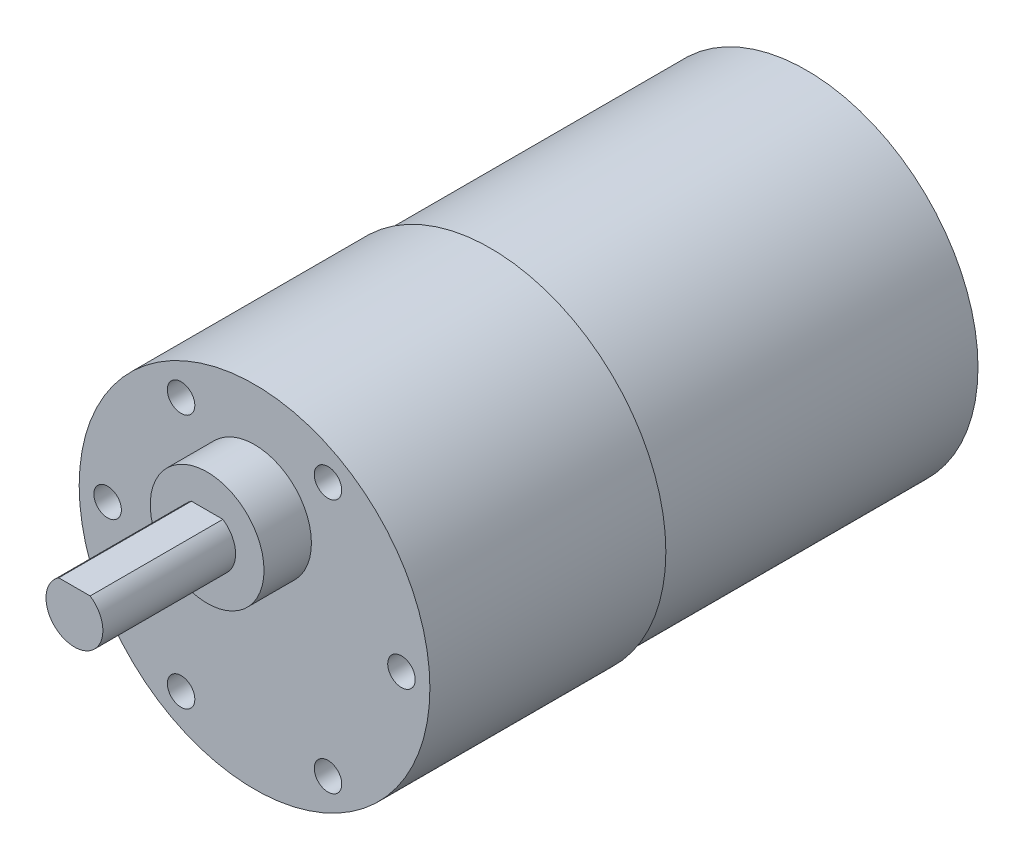
ISO-10303-21;
HEADER;
FILE_DESCRIPTION(('STEP AP214'),'2;1');
FILE_NAME('part.step','',(''),(''),'','','');
FILE_SCHEMA(('AUTOMOTIVE_DESIGN { 1 0 10303 214 1 1 1 1 }'));
ENDSEC;
DATA;
#1=APPLICATION_CONTEXT('core data for automotive mechanical design processes');
#2=APPLICATION_PROTOCOL_DEFINITION('international standard','automotive_design',2000,#1);
#3=PRODUCT_CONTEXT('',#1,'mechanical');
#4=PRODUCT('Part','Part','',(#3));
#5=PRODUCT_RELATED_PRODUCT_CATEGORY('part','',(#4));
#6=PRODUCT_DEFINITION_FORMATION('','',#4);
#7=PRODUCT_DEFINITION_CONTEXT('part definition',#1,'design');
#8=PRODUCT_DEFINITION('design','',#6,#7);
#9=PRODUCT_DEFINITION_SHAPE('','',#8);
#10=(LENGTH_UNIT() NAMED_UNIT(*) SI_UNIT(.MILLI.,.METRE.));
#11=(NAMED_UNIT(*) PLANE_ANGLE_UNIT() SI_UNIT($,.RADIAN.));
#12=(NAMED_UNIT(*) SI_UNIT($,.STERADIAN.) SOLID_ANGLE_UNIT());
#13=UNCERTAINTY_MEASURE_WITH_UNIT(LENGTH_MEASURE(1.E-05),#10,'distance_accuracy_value','');
#14=(GEOMETRIC_REPRESENTATION_CONTEXT(3) GLOBAL_UNCERTAINTY_ASSIGNED_CONTEXT((#13)) GLOBAL_UNIT_ASSIGNED_CONTEXT((#10,
#11,#12)) REPRESENTATION_CONTEXT('',''));
#15=CARTESIAN_POINT('',(0.,0.,0.));
#16=DIRECTION('',(0.,0.,1.));
#17=DIRECTION('',(1.,0.,0.));
#18=AXIS2_PLACEMENT_3D('',#15,#16,#17);
#19=CARTESIAN_POINT('',(0.,0.,24.892));
#20=DIRECTION('',(0.,0.,-1.));
#21=DIRECTION('',(-1.,0.,0.));
#22=AXIS2_PLACEMENT_3D('',#19,#20,#21);
#23=CYLINDRICAL_SURFACE('',#22,18.5);
#24=CARTESIAN_POINT('',(0.,0.,24.892));
#25=DIRECTION('',(0.,0.,1.));
#26=DIRECTION('',(1.,0.,0.));
#27=AXIS2_PLACEMENT_3D('',#24,#25,#26);
#28=CIRCLE('',#27,18.5);
#29=CARTESIAN_POINT('',(18.5,0.,24.892));
#30=VERTEX_POINT('',#29);
#31=EDGE_CURVE('E52',#30,#30,#28,.T.);
#32=ORIENTED_EDGE('',*,*,#31,.F.);
#33=EDGE_LOOP('',(#32));
#34=FACE_BOUND('',#33,.T.);
#35=CARTESIAN_POINT('',(0.,0.,0.));
#36=DIRECTION('',(0.,0.,1.));
#37=DIRECTION('',(1.,0.,0.));
#38=AXIS2_PLACEMENT_3D('',#35,#36,#37);
#39=CIRCLE('',#38,18.5);
#40=CARTESIAN_POINT('',(18.5,0.,0.));
#41=VERTEX_POINT('',#40);
#42=EDGE_CURVE('E47',#41,#41,#39,.T.);
#43=ORIENTED_EDGE('',*,*,#42,.T.);
#44=EDGE_LOOP('',(#43));
#45=FACE_BOUND('',#44,.T.);
#46=ADVANCED_FACE('F44',(#34,#45),#23,.T.);
#47=CARTESIAN_POINT('',(0.,0.,24.892));
#48=DIRECTION('',(0.,0.,1.));
#49=DIRECTION('',(1.,0.,0.));
#50=AXIS2_PLACEMENT_3D('',#47,#48,#49);
#51=PLANE('',#50);
#52=CARTESIAN_POINT('',(15.5,0.,24.892));
#53=DIRECTION('',(0.,0.,1.));
#54=DIRECTION('',(1.,0.,0.));
#55=AXIS2_PLACEMENT_3D('',#52,#53,#54);
#56=CIRCLE('',#55,1.45);
#57=CARTESIAN_POINT('',(16.95,0.,24.892));
#58=VERTEX_POINT('',#57);
#59=EDGE_CURVE('E350',#58,#58,#56,.T.);
#60=ORIENTED_EDGE('',*,*,#59,.F.);
#61=EDGE_LOOP('',(#60));
#62=FACE_BOUND('',#61,.T.);
#63=CARTESIAN_POINT('',(7.75000000000016,13.4233937586587,24.892));
#64=DIRECTION('',(0.,0.,1.));
#65=DIRECTION('',(1.,0.,0.));
#66=AXIS2_PLACEMENT_3D('',#63,#64,#65);
#67=CIRCLE('',#66,1.45);
#68=CARTESIAN_POINT('',(9.20000000000016,13.4233937586587,24.892));
#69=VERTEX_POINT('',#68);
#70=EDGE_CURVE('E351',#69,#69,#67,.T.);
#71=ORIENTED_EDGE('',*,*,#70,.F.);
#72=EDGE_LOOP('',(#71));
#73=FACE_BOUND('',#72,.T.);
#74=CARTESIAN_POINT('',(-7.74999999999987,13.4233937586589,24.892));
#75=DIRECTION('',(0.,0.,1.));
#76=DIRECTION('',(1.,0.,0.));
#77=AXIS2_PLACEMENT_3D('',#74,#75,#76);
#78=CIRCLE('',#77,1.45);
#79=CARTESIAN_POINT('',(-6.29999999999988,13.4233937586589,24.892));
#80=VERTEX_POINT('',#79);
#81=EDGE_CURVE('E325',#80,#80,#78,.T.);
#82=ORIENTED_EDGE('',*,*,#81,.F.);
#83=EDGE_LOOP('',(#82));
#84=FACE_BOUND('',#83,.T.);
#85=CARTESIAN_POINT('',(-15.5,1.08235921504137E-13,24.892));
#86=DIRECTION('',(0.,0.,1.));
#87=DIRECTION('',(1.,0.,0.));
#88=AXIS2_PLACEMENT_3D('',#85,#86,#87);
#89=CIRCLE('',#88,1.45);
#90=CARTESIAN_POINT('',(-14.05,1.08235921504137E-13,24.892));
#91=VERTEX_POINT('',#90);
#92=EDGE_CURVE('E332',#91,#91,#89,.T.);
#93=ORIENTED_EDGE('',*,*,#92,.F.);
#94=EDGE_LOOP('',(#93));
#95=FACE_BOUND('',#94,.T.);
#96=CARTESIAN_POINT('',(-7.75000000000006,-13.4233937586588,24.892));
#97=DIRECTION('',(0.,0.,1.));
#98=DIRECTION('',(1.,0.,0.));
#99=AXIS2_PLACEMENT_3D('',#96,#97,#98);
#100=CIRCLE('',#99,1.45);
#101=CARTESIAN_POINT('',(-6.30000000000006,-13.4233937586588,24.892));
#102=VERTEX_POINT('',#101);
#103=EDGE_CURVE('E338',#102,#102,#100,.T.);
#104=ORIENTED_EDGE('',*,*,#103,.F.);
#105=EDGE_LOOP('',(#104));
#106=FACE_BOUND('',#105,.T.);
#107=CARTESIAN_POINT('',(7.74999999999997,-13.4233937586588,24.892));
#108=DIRECTION('',(0.,0.,1.));
#109=DIRECTION('',(1.,0.,0.));
#110=AXIS2_PLACEMENT_3D('',#107,#108,#109);
#111=CIRCLE('',#110,1.45);
#112=CARTESIAN_POINT('',(9.19999999999997,-13.4233937586588,24.892));
#113=VERTEX_POINT('',#112);
#114=EDGE_CURVE('E344',#113,#113,#111,.T.);
#115=ORIENTED_EDGE('',*,*,#114,.F.);
#116=EDGE_LOOP('',(#115));
#117=FACE_BOUND('',#116,.T.);
#118=CARTESIAN_POINT('',(0.,7.,24.892));
#119=DIRECTION('',(0.,0.,1.));
#120=DIRECTION('',(1.,0.,0.));
#121=AXIS2_PLACEMENT_3D('',#118,#119,#120);
#122=CIRCLE('',#121,6.);
#123=CARTESIAN_POINT('',(6.,7.,24.892));
#124=VERTEX_POINT('',#123);
#125=EDGE_CURVE('E89',#124,#124,#122,.T.);
#126=ORIENTED_EDGE('',*,*,#125,.F.);
#127=EDGE_LOOP('',(#126));
#128=FACE_BOUND('',#127,.T.);
#129=ORIENTED_EDGE('',*,*,#31,.T.);
#130=EDGE_LOOP('',(#129));
#131=FACE_BOUND('',#130,.T.);
#132=ADVANCED_FACE('F110',(#62,#73,#84,#95,#106,#117,#128,#131),#51,.T.);
#133=CARTESIAN_POINT('',(0.,0.,0.));
#134=DIRECTION('',(0.,0.,1.));
#135=DIRECTION('',(1.,0.,0.));
#136=AXIS2_PLACEMENT_3D('',#133,#134,#135);
#137=PLANE('',#136);
#138=CARTESIAN_POINT('',(0.,0.,0.));
#139=DIRECTION('',(0.,0.,-1.));
#140=DIRECTION('',(-1.,0.,0.));
#141=AXIS2_PLACEMENT_3D('',#138,#139,#140);
#142=CIRCLE('',#141,18.1);
#143=CARTESIAN_POINT('',(-18.1,0.,0.));
#144=VERTEX_POINT('',#143);
#145=EDGE_CURVE('E13',#144,#144,#142,.T.);
#146=ORIENTED_EDGE('',*,*,#145,.F.);
#147=EDGE_LOOP('',(#146));
#148=FACE_BOUND('',#147,.T.);
#149=ORIENTED_EDGE('',*,*,#42,.F.);
#150=EDGE_LOOP('',(#149));
#151=FACE_BOUND('',#150,.T.);
#152=ADVANCED_FACE('F107',(#148,#151),#137,.F.);
#153=CARTESIAN_POINT('',(0.,0.,-33.33));
#154=DIRECTION('',(0.,0.,1.));
#155=DIRECTION('',(1.,0.,0.));
#156=AXIS2_PLACEMENT_3D('',#153,#154,#155);
#157=CYLINDRICAL_SURFACE('',#156,18.1);
#158=CARTESIAN_POINT('',(0.,0.,-33.33));
#159=DIRECTION('',(0.,0.,-1.));
#160=DIRECTION('',(-1.,0.,0.));
#161=AXIS2_PLACEMENT_3D('',#158,#159,#160);
#162=CIRCLE('',#161,18.1);
#163=CARTESIAN_POINT('',(-18.1,0.,-33.33));
#164=VERTEX_POINT('',#163);
#165=EDGE_CURVE('E96',#164,#164,#162,.T.);
#166=ORIENTED_EDGE('',*,*,#165,.F.);
#167=EDGE_LOOP('',(#166));
#168=FACE_BOUND('',#167,.T.);
#169=ORIENTED_EDGE('',*,*,#145,.T.);
#170=EDGE_LOOP('',(#169));
#171=FACE_BOUND('',#170,.T.);
#172=ADVANCED_FACE('F109',(#168,#171),#157,.T.);
#173=CARTESIAN_POINT('',(0.,0.,-33.33));
#174=DIRECTION('',(0.,0.,-1.));
#175=DIRECTION('',(-1.,0.,0.));
#176=AXIS2_PLACEMENT_3D('',#173,#174,#175);
#177=PLANE('',#176);
#178=ORIENTED_EDGE('',*,*,#165,.T.);
#179=EDGE_LOOP('',(#178));
#180=FACE_BOUND('',#179,.T.);
#181=ADVANCED_FACE('F116',(#180),#177,.T.);
#182=CARTESIAN_POINT('',(0.,7.,29.892));
#183=DIRECTION('',(0.,0.,-1.));
#184=DIRECTION('',(-1.,0.,0.));
#185=AXIS2_PLACEMENT_3D('',#182,#183,#184);
#186=CYLINDRICAL_SURFACE('',#185,6.);
#187=CARTESIAN_POINT('',(0.,7.,29.892));
#188=DIRECTION('',(0.,0.,1.));
#189=DIRECTION('',(1.,0.,0.));
#190=AXIS2_PLACEMENT_3D('',#187,#188,#189);
#191=CIRCLE('',#190,6.);
#192=CARTESIAN_POINT('',(6.,7.,29.892));
#193=VERTEX_POINT('',#192);
#194=EDGE_CURVE('E93',#193,#193,#191,.T.);
#195=ORIENTED_EDGE('',*,*,#194,.F.);
#196=EDGE_LOOP('',(#195));
#197=FACE_BOUND('',#196,.T.);
#198=ORIENTED_EDGE('',*,*,#125,.T.);
#199=EDGE_LOOP('',(#198));
#200=FACE_BOUND('',#199,.T.);
#201=ADVANCED_FACE('F270',(#197,#200),#186,.T.);
#202=CARTESIAN_POINT('',(0.,7.,29.892));
#203=DIRECTION('',(0.,0.,1.));
#204=DIRECTION('',(1.,0.,0.));
#205=AXIS2_PLACEMENT_3D('',#202,#203,#204);
#206=PLANE('',#205);
#207=CARTESIAN_POINT('',(0.,7.,29.892));
#208=DIRECTION('',(0.,0.,1.));
#209=DIRECTION('',(1.,0.,0.));
#210=AXIS2_PLACEMENT_3D('',#207,#208,#209);
#211=CIRCLE('',#210,3.);
#212=CARTESIAN_POINT('',(-1.6583123951777,9.5,29.892));
#213=VERTEX_POINT('',#212);
#214=CARTESIAN_POINT('',(1.6583123951777,9.5,29.892));
#215=VERTEX_POINT('',#214);
#216=EDGE_CURVE('E72',#213,#215,#211,.T.);
#217=ORIENTED_EDGE('',*,*,#216,.F.);
#218=DIRECTION('',(-1.,0.,0.));
#219=VECTOR('',#218,1.);
#220=CARTESIAN_POINT('',(1.6583123951777,9.5,29.892));
#221=LINE('',#220,#219);
#222=EDGE_CURVE('E59',#215,#213,#221,.T.);
#223=ORIENTED_EDGE('',*,*,#222,.F.);
#224=EDGE_LOOP('',(#217,#223));
#225=FACE_BOUND('',#224,.T.);
#226=ORIENTED_EDGE('',*,*,#194,.T.);
#227=EDGE_LOOP('',(#226));
#228=FACE_BOUND('',#227,.T.);
#229=ADVANCED_FACE('F73',(#225,#228),#206,.T.);
#230=CARTESIAN_POINT('',(0.,7.,43.892));
#231=DIRECTION('',(0.,0.,-1.));
#232=DIRECTION('',(-1.,0.,0.));
#233=AXIS2_PLACEMENT_3D('',#230,#231,#232);
#234=CYLINDRICAL_SURFACE('',#233,3.);
#235=ORIENTED_EDGE('',*,*,#216,.T.);
#236=DIRECTION('',(0.,0.,-1.));
#237=VECTOR('',#236,1.);
#238=CARTESIAN_POINT('',(1.6583123951777,9.5,43.892));
#239=LINE('',#238,#237);
#240=CARTESIAN_POINT('',(1.6583123951777,9.5,43.892));
#241=VERTEX_POINT('',#240);
#242=EDGE_CURVE('E84',#241,#215,#239,.T.);
#243=ORIENTED_EDGE('',*,*,#242,.F.);
#244=CARTESIAN_POINT('',(0.,7.,43.892));
#245=DIRECTION('',(0.,0.,1.));
#246=DIRECTION('',(1.,0.,0.));
#247=AXIS2_PLACEMENT_3D('',#244,#245,#246);
#248=CIRCLE('',#247,3.);
#249=CARTESIAN_POINT('',(-1.6583123951777,9.5,43.892));
#250=VERTEX_POINT('',#249);
#251=EDGE_CURVE('E85',#250,#241,#248,.T.);
#252=ORIENTED_EDGE('',*,*,#251,.F.);
#253=DIRECTION('',(0.,0.,-1.));
#254=VECTOR('',#253,1.);
#255=CARTESIAN_POINT('',(-1.6583123951777,9.5,43.892));
#256=LINE('',#255,#254);
#257=EDGE_CURVE('E82',#250,#213,#256,.T.);
#258=ORIENTED_EDGE('',*,*,#257,.T.);
#259=EDGE_LOOP('',(#235,#243,#252,#258));
#260=FACE_BOUND('',#259,.T.);
#261=ADVANCED_FACE('F87',(#260),#234,.T.);
#262=CARTESIAN_POINT('',(1.6583123951777,9.5,43.892));
#263=DIRECTION('',(0.,-1.,0.));
#264=DIRECTION('',(0.,0.,-1.));
#265=AXIS2_PLACEMENT_3D('',#262,#263,#264);
#266=PLANE('',#265);
#267=ORIENTED_EDGE('',*,*,#222,.T.);
#268=ORIENTED_EDGE('',*,*,#257,.F.);
#269=DIRECTION('',(-1.,0.,0.));
#270=VECTOR('',#269,1.);
#271=CARTESIAN_POINT('',(1.6583123951777,9.5,43.892));
#272=LINE('',#271,#270);
#273=EDGE_CURVE('E67',#241,#250,#272,.T.);
#274=ORIENTED_EDGE('',*,*,#273,.F.);
#275=ORIENTED_EDGE('',*,*,#242,.T.);
#276=EDGE_LOOP('',(#267,#268,#274,#275));
#277=FACE_BOUND('',#276,.T.);
#278=ADVANCED_FACE('F81',(#277),#266,.F.);
#279=CARTESIAN_POINT('',(0.,7.,43.892));
#280=DIRECTION('',(0.,0.,1.));
#281=DIRECTION('',(1.,0.,0.));
#282=AXIS2_PLACEMENT_3D('',#279,#280,#281);
#283=PLANE('',#282);
#284=ORIENTED_EDGE('',*,*,#251,.T.);
#285=ORIENTED_EDGE('',*,*,#273,.T.);
#286=EDGE_LOOP('',(#284,#285));
#287=FACE_BOUND('',#286,.T.);
#288=ADVANCED_FACE('F137',(#287),#283,.T.);
#289=CARTESIAN_POINT('',(7.74999999999997,-13.4233937586588,19.892));
#290=DIRECTION('',(0.,0.,1.));
#291=DIRECTION('',(1.,0.,0.));
#292=AXIS2_PLACEMENT_3D('',#289,#290,#291);
#293=CYLINDRICAL_SURFACE('',#292,1.45);
#294=CARTESIAN_POINT('',(7.74999999999997,-13.4233937586588,19.892));
#295=DIRECTION('',(0.,0.,1.));
#296=DIRECTION('',(1.,0.,0.));
#297=AXIS2_PLACEMENT_3D('',#294,#295,#296);
#298=CIRCLE('',#297,1.45);
#299=CARTESIAN_POINT('',(9.19999999999997,-13.4233937586588,19.892));
#300=VERTEX_POINT('',#299);
#301=EDGE_CURVE('E347',#300,#300,#298,.T.);
#302=ORIENTED_EDGE('',*,*,#301,.F.);
#303=EDGE_LOOP('',(#302));
#304=FACE_BOUND('',#303,.T.);
#305=ORIENTED_EDGE('',*,*,#114,.T.);
#306=EDGE_LOOP('',(#305));
#307=FACE_BOUND('',#306,.T.);
#308=ADVANCED_FACE('F142',(#304,#307),#293,.F.);
#309=CARTESIAN_POINT('',(7.74999999999997,-13.4233937586588,19.892));
#310=DIRECTION('',(0.,0.,1.));
#311=DIRECTION('',(1.,0.,0.));
#312=AXIS2_PLACEMENT_3D('',#309,#310,#311);
#313=PLANE('',#312);
#314=ORIENTED_EDGE('',*,*,#301,.T.);
#315=EDGE_LOOP('',(#314));
#316=FACE_BOUND('',#315,.T.);
#317=ADVANCED_FACE('F147',(#316),#313,.T.);
#318=CARTESIAN_POINT('',(-7.75000000000006,-13.4233937586588,19.892));
#319=DIRECTION('',(0.,0.,1.));
#320=DIRECTION('',(1.,0.,0.));
#321=AXIS2_PLACEMENT_3D('',#318,#319,#320);
#322=CYLINDRICAL_SURFACE('',#321,1.45);
#323=CARTESIAN_POINT('',(-7.75000000000006,-13.4233937586588,19.892));
#324=DIRECTION('',(0.,0.,1.));
#325=DIRECTION('',(1.,0.,0.));
#326=AXIS2_PLACEMENT_3D('',#323,#324,#325);
#327=CIRCLE('',#326,1.45);
#328=CARTESIAN_POINT('',(-6.30000000000006,-13.4233937586588,19.892));
#329=VERTEX_POINT('',#328);
#330=EDGE_CURVE('E341',#329,#329,#327,.T.);
#331=ORIENTED_EDGE('',*,*,#330,.F.);
#332=EDGE_LOOP('',(#331));
#333=FACE_BOUND('',#332,.T.);
#334=ORIENTED_EDGE('',*,*,#103,.T.);
#335=EDGE_LOOP('',(#334));
#336=FACE_BOUND('',#335,.T.);
#337=ADVANCED_FACE('F157',(#333,#336),#322,.F.);
#338=CARTESIAN_POINT('',(-7.75000000000006,-13.4233937586588,19.892));
#339=DIRECTION('',(0.,0.,1.));
#340=DIRECTION('',(1.,0.,0.));
#341=AXIS2_PLACEMENT_3D('',#338,#339,#340);
#342=PLANE('',#341);
#343=ORIENTED_EDGE('',*,*,#330,.T.);
#344=EDGE_LOOP('',(#343));
#345=FACE_BOUND('',#344,.T.);
#346=ADVANCED_FACE('F167',(#345),#342,.T.);
#347=CARTESIAN_POINT('',(-15.5,1.08235921504137E-13,19.892));
#348=DIRECTION('',(0.,0.,1.));
#349=DIRECTION('',(1.,0.,0.));
#350=AXIS2_PLACEMENT_3D('',#347,#348,#349);
#351=CYLINDRICAL_SURFACE('',#350,1.45);
#352=CARTESIAN_POINT('',(-15.5,1.08235921504137E-13,19.892));
#353=DIRECTION('',(0.,0.,1.));
#354=DIRECTION('',(1.,0.,0.));
#355=AXIS2_PLACEMENT_3D('',#352,#353,#354);
#356=CIRCLE('',#355,1.45);
#357=CARTESIAN_POINT('',(-14.05,1.08235921504137E-13,19.892));
#358=VERTEX_POINT('',#357);
#359=EDGE_CURVE('E335',#358,#358,#356,.T.);
#360=ORIENTED_EDGE('',*,*,#359,.F.);
#361=EDGE_LOOP('',(#360));
#362=FACE_BOUND('',#361,.T.);
#363=ORIENTED_EDGE('',*,*,#92,.T.);
#364=EDGE_LOOP('',(#363));
#365=FACE_BOUND('',#364,.T.);
#366=ADVANCED_FACE('F177',(#362,#365),#351,.F.);
#367=CARTESIAN_POINT('',(-15.5,1.08235921504137E-13,19.892));
#368=DIRECTION('',(0.,0.,1.));
#369=DIRECTION('',(1.,0.,0.));
#370=AXIS2_PLACEMENT_3D('',#367,#368,#369);
#371=PLANE('',#370);
#372=ORIENTED_EDGE('',*,*,#359,.T.);
#373=EDGE_LOOP('',(#372));
#374=FACE_BOUND('',#373,.T.);
#375=ADVANCED_FACE('F187',(#374),#371,.T.);
#376=CARTESIAN_POINT('',(-7.74999999999987,13.4233937586589,19.892));
#377=DIRECTION('',(0.,0.,1.));
#378=DIRECTION('',(1.,0.,0.));
#379=AXIS2_PLACEMENT_3D('',#376,#377,#378);
#380=CYLINDRICAL_SURFACE('',#379,1.45);
#381=CARTESIAN_POINT('',(-7.74999999999987,13.4233937586589,19.892));
#382=DIRECTION('',(0.,0.,1.));
#383=DIRECTION('',(1.,0.,0.));
#384=AXIS2_PLACEMENT_3D('',#381,#382,#383);
#385=CIRCLE('',#384,1.45);
#386=CARTESIAN_POINT('',(-6.29999999999988,13.4233937586589,19.892));
#387=VERTEX_POINT('',#386);
#388=EDGE_CURVE('E328',#387,#387,#385,.T.);
#389=ORIENTED_EDGE('',*,*,#388,.F.);
#390=EDGE_LOOP('',(#389));
#391=FACE_BOUND('',#390,.T.);
#392=ORIENTED_EDGE('',*,*,#81,.T.);
#393=EDGE_LOOP('',(#392));
#394=FACE_BOUND('',#393,.T.);
#395=ADVANCED_FACE('F197',(#391,#394),#380,.F.);
#396=CARTESIAN_POINT('',(-7.74999999999987,13.4233937586589,19.892));
#397=DIRECTION('',(0.,0.,1.));
#398=DIRECTION('',(1.,0.,0.));
#399=AXIS2_PLACEMENT_3D('',#396,#397,#398);
#400=PLANE('',#399);
#401=ORIENTED_EDGE('',*,*,#388,.T.);
#402=EDGE_LOOP('',(#401));
#403=FACE_BOUND('',#402,.T.);
#404=ADVANCED_FACE('F207',(#403),#400,.T.);
#405=CARTESIAN_POINT('',(7.75000000000016,13.4233937586587,19.892));
#406=DIRECTION('',(0.,0.,1.));
#407=DIRECTION('',(1.,0.,0.));
#408=AXIS2_PLACEMENT_3D('',#405,#406,#407);
#409=CYLINDRICAL_SURFACE('',#408,1.45);
#410=CARTESIAN_POINT('',(7.75000000000016,13.4233937586587,19.892));
#411=DIRECTION('',(0.,0.,1.));
#412=DIRECTION('',(1.,0.,0.));
#413=AXIS2_PLACEMENT_3D('',#410,#411,#412);
#414=CIRCLE('',#413,1.45);
#415=CARTESIAN_POINT('',(9.20000000000016,13.4233937586587,19.892));
#416=VERTEX_POINT('',#415);
#417=EDGE_CURVE('E329',#416,#416,#414,.T.);
#418=ORIENTED_EDGE('',*,*,#417,.F.);
#419=EDGE_LOOP('',(#418));
#420=FACE_BOUND('',#419,.T.);
#421=ORIENTED_EDGE('',*,*,#70,.T.);
#422=EDGE_LOOP('',(#421));
#423=FACE_BOUND('',#422,.T.);
#424=ADVANCED_FACE('F217',(#420,#423),#409,.F.);
#425=CARTESIAN_POINT('',(7.75000000000016,13.4233937586587,19.892));
#426=DIRECTION('',(0.,0.,1.));
#427=DIRECTION('',(1.,0.,0.));
#428=AXIS2_PLACEMENT_3D('',#425,#426,#427);
#429=PLANE('',#428);
#430=ORIENTED_EDGE('',*,*,#417,.T.);
#431=EDGE_LOOP('',(#430));
#432=FACE_BOUND('',#431,.T.);
#433=ADVANCED_FACE('F227',(#432),#429,.T.);
#434=CARTESIAN_POINT('',(15.5,0.,19.892));
#435=DIRECTION('',(0.,0.,1.));
#436=DIRECTION('',(1.,0.,0.));
#437=AXIS2_PLACEMENT_3D('',#434,#435,#436);
#438=CYLINDRICAL_SURFACE('',#437,1.45);
#439=CARTESIAN_POINT('',(15.5,0.,19.892));
#440=DIRECTION('',(0.,0.,1.));
#441=DIRECTION('',(1.,0.,0.));
#442=AXIS2_PLACEMENT_3D('',#439,#440,#441);
#443=CIRCLE('',#442,1.45);
#444=CARTESIAN_POINT('',(16.95,0.,19.892));
#445=VERTEX_POINT('',#444);
#446=EDGE_CURVE('E78',#445,#445,#443,.T.);
#447=ORIENTED_EDGE('',*,*,#446,.F.);
#448=EDGE_LOOP('',(#447));
#449=FACE_BOUND('',#448,.T.);
#450=ORIENTED_EDGE('',*,*,#59,.T.);
#451=EDGE_LOOP('',(#450));
#452=FACE_BOUND('',#451,.T.);
#453=ADVANCED_FACE('F237',(#449,#452),#438,.F.);
#454=CARTESIAN_POINT('',(15.5,0.,19.892));
#455=DIRECTION('',(0.,0.,1.));
#456=DIRECTION('',(1.,0.,0.));
#457=AXIS2_PLACEMENT_3D('',#454,#455,#456);
#458=PLANE('',#457);
#459=ORIENTED_EDGE('',*,*,#446,.T.);
#460=EDGE_LOOP('',(#459));
#461=FACE_BOUND('',#460,.T.);
#462=ADVANCED_FACE('F247',(#461),#458,.T.);
#463=CLOSED_SHELL('',(#46,#132,#152,#172,#181,#201,#229,#261,#278,#288,#308,#317,#337,#346,#366,
#375,#395,#404,#424,#433,#453,#462));
#464=MANIFOLD_SOLID_BREP('B2',#463);
#465=ADVANCED_BREP_SHAPE_REPRESENTATION('',(#18,#464),#14);
#466=SHAPE_DEFINITION_REPRESENTATION(#9,#465);
ENDSEC;
END-ISO-10303-21;
